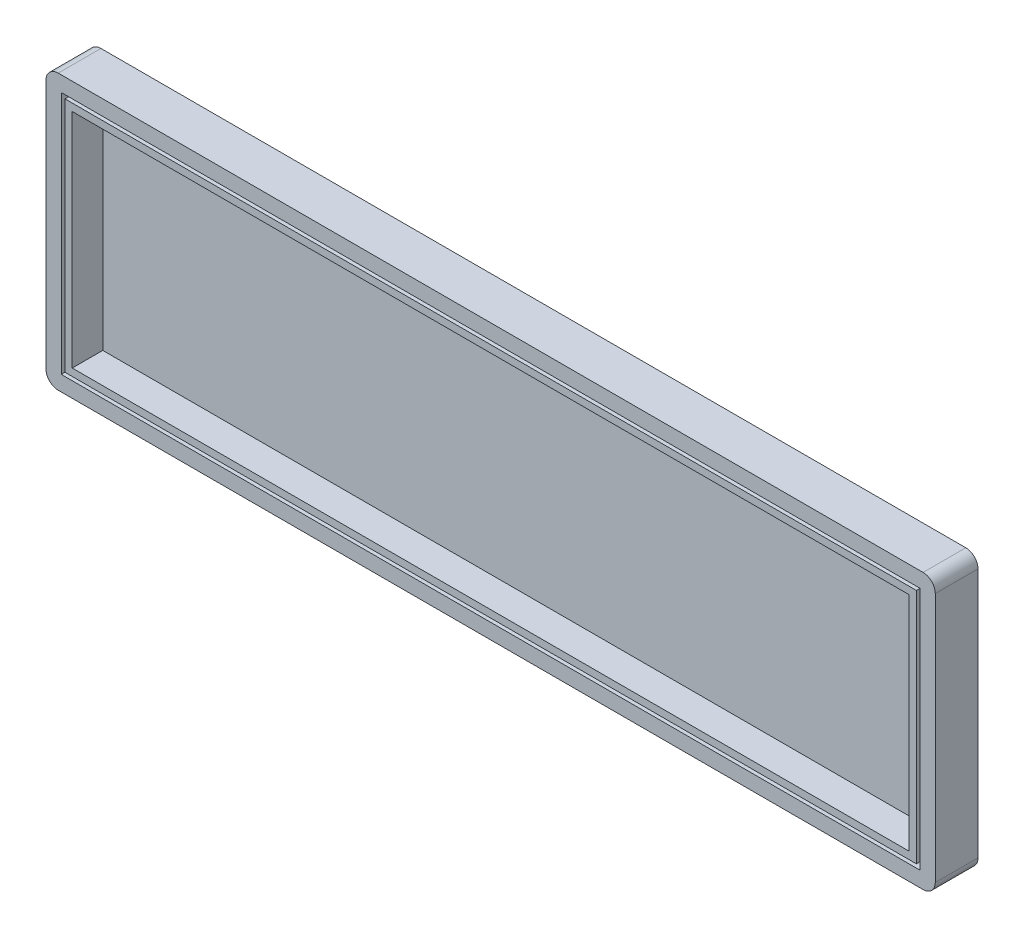
ISO-10303-21;
HEADER;
FILE_DESCRIPTION(('STEP AP214'),'2;1');
FILE_NAME('part.step','',(''),(''),'','','');
FILE_SCHEMA(('AUTOMOTIVE_DESIGN { 1 0 10303 214 1 1 1 1 }'));
ENDSEC;
DATA;
#1=APPLICATION_CONTEXT('core data for automotive mechanical design processes');
#2=APPLICATION_PROTOCOL_DEFINITION('international standard','automotive_design',2000,#1);
#3=PRODUCT_CONTEXT('',#1,'mechanical');
#4=PRODUCT('Part','Part','',(#3));
#5=PRODUCT_RELATED_PRODUCT_CATEGORY('part','',(#4));
#6=PRODUCT_DEFINITION_FORMATION('','',#4);
#7=PRODUCT_DEFINITION_CONTEXT('part definition',#1,'design');
#8=PRODUCT_DEFINITION('design','',#6,#7);
#9=PRODUCT_DEFINITION_SHAPE('','',#8);
#10=(LENGTH_UNIT() NAMED_UNIT(*) SI_UNIT(.MILLI.,.METRE.));
#11=(NAMED_UNIT(*) PLANE_ANGLE_UNIT() SI_UNIT($,.RADIAN.));
#12=(NAMED_UNIT(*) SI_UNIT($,.STERADIAN.) SOLID_ANGLE_UNIT());
#13=UNCERTAINTY_MEASURE_WITH_UNIT(LENGTH_MEASURE(1.E-05),#10,'distance_accuracy_value','');
#14=(GEOMETRIC_REPRESENTATION_CONTEXT(3) GLOBAL_UNCERTAINTY_ASSIGNED_CONTEXT((#13)) GLOBAL_UNIT_ASSIGNED_CONTEXT((#10,
#11,#12)) REPRESENTATION_CONTEXT('',''));
#15=CARTESIAN_POINT('',(0.,0.,0.));
#16=DIRECTION('',(0.,0.,1.));
#17=DIRECTION('',(1.,0.,0.));
#18=AXIS2_PLACEMENT_3D('',#15,#16,#17);
#19=CARTESIAN_POINT('',(0.,0.,2.));
#20=DIRECTION('',(1.,0.,0.));
#21=DIRECTION('',(0.,0.,-1.));
#22=AXIS2_PLACEMENT_3D('',#19,#20,#21);
#23=PLANE('',#22);
#24=DIRECTION('',(0.,-1.,0.));
#25=VECTOR('',#24,1.);
#26=CARTESIAN_POINT('',(0.,0.,7.));
#27=LINE('',#26,#25);
#28=CARTESIAN_POINT('',(0.,43.,7.));
#29=VERTEX_POINT('',#28);
#30=CARTESIAN_POINT('',(0.,2.,7.));
#31=VERTEX_POINT('',#30);
#32=EDGE_CURVE('E280',#29,#31,#27,.T.);
#33=ORIENTED_EDGE('',*,*,#32,.F.);
#34=DIRECTION('',(0.,0.,-1.));
#35=VECTOR('',#34,1.);
#36=CARTESIAN_POINT('',(0.,43.,2.));
#37=LINE('',#36,#35);
#38=CARTESIAN_POINT('',(0.,43.,0.));
#39=VERTEX_POINT('',#38);
#40=EDGE_CURVE('E12',#29,#39,#37,.T.);
#41=ORIENTED_EDGE('',*,*,#40,.T.);
#42=DIRECTION('',(0.,-1.,0.));
#43=VECTOR('',#42,1.);
#44=CARTESIAN_POINT('',(0.,0.,0.));
#45=LINE('',#44,#43);
#46=CARTESIAN_POINT('',(0.,2.,0.));
#47=VERTEX_POINT('',#46);
#48=EDGE_CURVE('E318',#39,#47,#45,.T.);
#49=ORIENTED_EDGE('',*,*,#48,.T.);
#50=DIRECTION('',(0.,0.,-1.));
#51=VECTOR('',#50,1.);
#52=CARTESIAN_POINT('',(0.,2.,2.));
#53=LINE('',#52,#51);
#54=EDGE_CURVE('E69',#47,#31,#53,.F.);
#55=ORIENTED_EDGE('',*,*,#54,.T.);
#56=EDGE_LOOP('',(#33,#41,#49,#55));
#57=FACE_BOUND('',#56,.T.);
#58=ADVANCED_FACE('F61',(#57),#23,.F.);
#59=CARTESIAN_POINT('',(0.,0.,2.));
#60=DIRECTION('',(0.,1.,0.));
#61=DIRECTION('',(0.,0.,1.));
#62=AXIS2_PLACEMENT_3D('',#59,#60,#61);
#63=PLANE('',#62);
#64=DIRECTION('',(1.,0.,0.));
#65=VECTOR('',#64,1.);
#66=CARTESIAN_POINT('',(0.,0.,0.));
#67=LINE('',#66,#65);
#68=CARTESIAN_POINT('',(2.,0.,0.));
#69=VERTEX_POINT('',#68);
#70=CARTESIAN_POINT('',(143.7,0.,0.));
#71=VERTEX_POINT('',#70);
#72=EDGE_CURVE('E321',#69,#71,#67,.T.);
#73=ORIENTED_EDGE('',*,*,#72,.T.);
#74=DIRECTION('',(0.,0.,-1.));
#75=VECTOR('',#74,1.);
#76=CARTESIAN_POINT('',(143.7,0.,2.));
#77=LINE('',#76,#75);
#78=CARTESIAN_POINT('',(143.7,0.,7.));
#79=VERTEX_POINT('',#78);
#80=EDGE_CURVE('E76',#71,#79,#77,.F.);
#81=ORIENTED_EDGE('',*,*,#80,.T.);
#82=DIRECTION('',(1.,0.,0.));
#83=VECTOR('',#82,1.);
#84=CARTESIAN_POINT('',(0.,0.,7.));
#85=LINE('',#84,#83);
#86=CARTESIAN_POINT('',(2.,0.,7.));
#87=VERTEX_POINT('',#86);
#88=EDGE_CURVE('E283',#87,#79,#85,.T.);
#89=ORIENTED_EDGE('',*,*,#88,.F.);
#90=DIRECTION('',(0.,0.,-1.));
#91=VECTOR('',#90,1.);
#92=CARTESIAN_POINT('',(2.,0.,2.));
#93=LINE('',#92,#91);
#94=EDGE_CURVE('E354',#87,#69,#93,.T.);
#95=ORIENTED_EDGE('',*,*,#94,.T.);
#96=EDGE_LOOP('',(#73,#81,#89,#95));
#97=FACE_BOUND('',#96,.T.);
#98=ADVANCED_FACE('F368',(#97),#63,.F.);
#99=CARTESIAN_POINT('',(145.7,0.,2.));
#100=DIRECTION('',(-1.,0.,0.));
#101=DIRECTION('',(0.,0.,1.));
#102=AXIS2_PLACEMENT_3D('',#99,#100,#101);
#103=PLANE('',#102);
#104=DIRECTION('',(0.,1.,0.));
#105=VECTOR('',#104,1.);
#106=CARTESIAN_POINT('',(145.7,0.,0.));
#107=LINE('',#106,#105);
#108=CARTESIAN_POINT('',(145.7,2.,0.));
#109=VERTEX_POINT('',#108);
#110=CARTESIAN_POINT('',(145.7,43.,0.));
#111=VERTEX_POINT('',#110);
#112=EDGE_CURVE('E323',#109,#111,#107,.T.);
#113=ORIENTED_EDGE('',*,*,#112,.T.);
#114=DIRECTION('',(0.,0.,-1.));
#115=VECTOR('',#114,1.);
#116=CARTESIAN_POINT('',(145.7,43.,2.));
#117=LINE('',#116,#115);
#118=CARTESIAN_POINT('',(145.7,43.,7.));
#119=VERTEX_POINT('',#118);
#120=EDGE_CURVE('E345',#111,#119,#117,.F.);
#121=ORIENTED_EDGE('',*,*,#120,.T.);
#122=DIRECTION('',(0.,1.,0.));
#123=VECTOR('',#122,1.);
#124=CARTESIAN_POINT('',(145.7,0.,7.));
#125=LINE('',#124,#123);
#126=CARTESIAN_POINT('',(145.7,2.,7.));
#127=VERTEX_POINT('',#126);
#128=EDGE_CURVE('E285',#127,#119,#125,.T.);
#129=ORIENTED_EDGE('',*,*,#128,.F.);
#130=DIRECTION('',(0.,0.,-1.));
#131=VECTOR('',#130,1.);
#132=CARTESIAN_POINT('',(145.7,2.,2.));
#133=LINE('',#132,#131);
#134=EDGE_CURVE('E342',#127,#109,#133,.T.);
#135=ORIENTED_EDGE('',*,*,#134,.T.);
#136=EDGE_LOOP('',(#113,#121,#129,#135));
#137=FACE_BOUND('',#136,.T.);
#138=ADVANCED_FACE('F379',(#137),#103,.F.);
#139=CARTESIAN_POINT('',(0.,45.,2.));
#140=DIRECTION('',(0.,-1.,0.));
#141=DIRECTION('',(0.,0.,-1.));
#142=AXIS2_PLACEMENT_3D('',#139,#140,#141);
#143=PLANE('',#142);
#144=DIRECTION('',(-1.,0.,0.));
#145=VECTOR('',#144,1.);
#146=CARTESIAN_POINT('',(0.,45.,7.));
#147=LINE('',#146,#145);
#148=CARTESIAN_POINT('',(143.7,45.,7.));
#149=VERTEX_POINT('',#148);
#150=CARTESIAN_POINT('',(2.,45.,7.));
#151=VERTEX_POINT('',#150);
#152=EDGE_CURVE('E277',#149,#151,#147,.T.);
#153=ORIENTED_EDGE('',*,*,#152,.F.);
#154=DIRECTION('',(0.,0.,-1.));
#155=VECTOR('',#154,1.);
#156=CARTESIAN_POINT('',(143.7,45.,2.));
#157=LINE('',#156,#155);
#158=CARTESIAN_POINT('',(143.7,45.,0.));
#159=VERTEX_POINT('',#158);
#160=EDGE_CURVE('E331',#149,#159,#157,.T.);
#161=ORIENTED_EDGE('',*,*,#160,.T.);
#162=DIRECTION('',(-1.,0.,0.));
#163=VECTOR('',#162,1.);
#164=CARTESIAN_POINT('',(0.,45.,0.));
#165=LINE('',#164,#163);
#166=CARTESIAN_POINT('',(2.,45.,0.));
#167=VERTEX_POINT('',#166);
#168=EDGE_CURVE('E326',#159,#167,#165,.T.);
#169=ORIENTED_EDGE('',*,*,#168,.T.);
#170=DIRECTION('',(0.,0.,-1.));
#171=VECTOR('',#170,1.);
#172=CARTESIAN_POINT('',(2.,45.,2.));
#173=LINE('',#172,#171);
#174=EDGE_CURVE('E329',#167,#151,#173,.F.);
#175=ORIENTED_EDGE('',*,*,#174,.T.);
#176=EDGE_LOOP('',(#153,#161,#169,#175));
#177=FACE_BOUND('',#176,.T.);
#178=ADVANCED_FACE('F387',(#177),#143,.F.);
#179=CARTESIAN_POINT('',(0.,0.,0.));
#180=DIRECTION('',(0.,0.,-1.));
#181=DIRECTION('',(-1.,0.,0.));
#182=AXIS2_PLACEMENT_3D('',#179,#180,#181);
#183=PLANE('',#182);
#184=ORIENTED_EDGE('',*,*,#168,.F.);
#185=CARTESIAN_POINT('',(143.7,43.,0.));
#186=DIRECTION('',(0.,0.,-1.));
#187=DIRECTION('',(-1.,0.,0.));
#188=AXIS2_PLACEMENT_3D('',#185,#186,#187);
#189=CIRCLE('',#188,2.);
#190=EDGE_CURVE('E340',#159,#111,#189,.T.);
#191=ORIENTED_EDGE('',*,*,#190,.T.);
#192=ORIENTED_EDGE('',*,*,#112,.F.);
#193=CARTESIAN_POINT('',(143.7,2.,0.));
#194=DIRECTION('',(0.,0.,-1.));
#195=DIRECTION('',(-1.,0.,0.));
#196=AXIS2_PLACEMENT_3D('',#193,#194,#195);
#197=CIRCLE('',#196,2.);
#198=EDGE_CURVE('E338',#109,#71,#197,.T.);
#199=ORIENTED_EDGE('',*,*,#198,.T.);
#200=ORIENTED_EDGE('',*,*,#72,.F.);
#201=CARTESIAN_POINT('',(2.,2.,0.));
#202=DIRECTION('',(0.,0.,-1.));
#203=DIRECTION('',(-1.,0.,0.));
#204=AXIS2_PLACEMENT_3D('',#201,#202,#203);
#205=CIRCLE('',#204,2.);
#206=EDGE_CURVE('E334',#69,#47,#205,.T.);
#207=ORIENTED_EDGE('',*,*,#206,.T.);
#208=ORIENTED_EDGE('',*,*,#48,.F.);
#209=CARTESIAN_POINT('',(2.,43.,0.));
#210=DIRECTION('',(0.,0.,-1.));
#211=DIRECTION('',(-1.,0.,0.));
#212=AXIS2_PLACEMENT_3D('',#209,#210,#211);
#213=CIRCLE('',#212,2.);
#214=EDGE_CURVE('E336',#39,#167,#213,.T.);
#215=ORIENTED_EDGE('',*,*,#214,.T.);
#216=EDGE_LOOP('',(#184,#191,#192,#199,#200,#207,#208,#215));
#217=FACE_BOUND('',#216,.T.);
#218=ADVANCED_FACE('F371',(#217),#183,.T.);
#219=CARTESIAN_POINT('',(0.,2.50000000000002,7.));
#220=DIRECTION('',(0.,-1.,0.));
#221=DIRECTION('',(0.,0.,-1.));
#222=AXIS2_PLACEMENT_3D('',#219,#220,#221);
#223=PLANE('',#222);
#224=DIRECTION('',(-1.,0.,0.));
#225=VECTOR('',#224,1.);
#226=CARTESIAN_POINT('',(0.,2.50000000000002,2.));
#227=LINE('',#226,#225);
#228=CARTESIAN_POINT('',(143.2,2.50000000000002,2.));
#229=VERTEX_POINT('',#228);
#230=CARTESIAN_POINT('',(2.5,2.50000000000002,2.));
#231=VERTEX_POINT('',#230);
#232=EDGE_CURVE('E271',#229,#231,#227,.T.);
#233=ORIENTED_EDGE('',*,*,#232,.T.);
#234=DIRECTION('',(0.,0.,-1.));
#235=VECTOR('',#234,1.);
#236=CARTESIAN_POINT('',(2.5,2.50000000000002,7.));
#237=LINE('',#236,#235);
#238=CARTESIAN_POINT('',(2.5,2.50000000000002,7.));
#239=VERTEX_POINT('',#238);
#240=EDGE_CURVE('E316',#239,#231,#237,.T.);
#241=ORIENTED_EDGE('',*,*,#240,.F.);
#242=DIRECTION('',(-1.,0.,0.));
#243=VECTOR('',#242,1.);
#244=CARTESIAN_POINT('',(0.,2.50000000000002,7.));
#245=LINE('',#244,#243);
#246=CARTESIAN_POINT('',(143.2,2.50000000000002,7.));
#247=VERTEX_POINT('',#246);
#248=EDGE_CURVE('E288',#247,#239,#245,.T.);
#249=ORIENTED_EDGE('',*,*,#248,.F.);
#250=DIRECTION('',(0.,0.,-1.));
#251=VECTOR('',#250,1.);
#252=CARTESIAN_POINT('',(143.2,2.50000000000002,7.));
#253=LINE('',#252,#251);
#254=EDGE_CURVE('E299',#247,#229,#253,.T.);
#255=ORIENTED_EDGE('',*,*,#254,.T.);
#256=EDGE_LOOP('',(#233,#241,#249,#255));
#257=FACE_BOUND('',#256,.T.);
#258=ADVANCED_FACE('F439',(#257),#223,.F.);
#259=CARTESIAN_POINT('',(2.5,0.,7.));
#260=DIRECTION('',(-1.,0.,0.));
#261=DIRECTION('',(0.,0.,1.));
#262=AXIS2_PLACEMENT_3D('',#259,#260,#261);
#263=PLANE('',#262);
#264=DIRECTION('',(0.,1.,0.));
#265=VECTOR('',#264,1.);
#266=CARTESIAN_POINT('',(2.5,0.,2.));
#267=LINE('',#266,#265);
#268=CARTESIAN_POINT('',(2.5,42.5,2.));
#269=VERTEX_POINT('',#268);
#270=EDGE_CURVE('E302',#231,#269,#267,.T.);
#271=ORIENTED_EDGE('',*,*,#270,.T.);
#272=DIRECTION('',(0.,0.,-1.));
#273=VECTOR('',#272,1.);
#274=CARTESIAN_POINT('',(2.5,42.5,7.));
#275=LINE('',#274,#273);
#276=CARTESIAN_POINT('',(2.5,42.5,7.));
#277=VERTEX_POINT('',#276);
#278=EDGE_CURVE('E314',#277,#269,#275,.T.);
#279=ORIENTED_EDGE('',*,*,#278,.F.);
#280=DIRECTION('',(0.,1.,0.));
#281=VECTOR('',#280,1.);
#282=CARTESIAN_POINT('',(2.5,0.,7.));
#283=LINE('',#282,#281);
#284=EDGE_CURVE('E291',#239,#277,#283,.T.);
#285=ORIENTED_EDGE('',*,*,#284,.F.);
#286=ORIENTED_EDGE('',*,*,#240,.T.);
#287=EDGE_LOOP('',(#271,#279,#285,#286));
#288=FACE_BOUND('',#287,.T.);
#289=ADVANCED_FACE('F448',(#288),#263,.F.);
#290=CARTESIAN_POINT('',(0.,42.5,7.));
#291=DIRECTION('',(0.,-1.,0.));
#292=DIRECTION('',(0.,0.,-1.));
#293=AXIS2_PLACEMENT_3D('',#290,#291,#292);
#294=PLANE('',#293);
#295=DIRECTION('',(-1.,0.,0.));
#296=VECTOR('',#295,1.);
#297=CARTESIAN_POINT('',(0.,42.5,2.));
#298=LINE('',#297,#296);
#299=CARTESIAN_POINT('',(143.2,42.5,2.));
#300=VERTEX_POINT('',#299);
#301=EDGE_CURVE('E305',#300,#269,#298,.T.);
#302=ORIENTED_EDGE('',*,*,#301,.F.);
#303=DIRECTION('',(0.,0.,-1.));
#304=VECTOR('',#303,1.);
#305=CARTESIAN_POINT('',(143.2,42.5,7.));
#306=LINE('',#305,#304);
#307=CARTESIAN_POINT('',(143.2,42.5,7.));
#308=VERTEX_POINT('',#307);
#309=EDGE_CURVE('E311',#308,#300,#306,.T.);
#310=ORIENTED_EDGE('',*,*,#309,.F.);
#311=DIRECTION('',(-1.,0.,0.));
#312=VECTOR('',#311,1.);
#313=CARTESIAN_POINT('',(0.,42.5,7.));
#314=LINE('',#313,#312);
#315=EDGE_CURVE('E293',#308,#277,#314,.T.);
#316=ORIENTED_EDGE('',*,*,#315,.T.);
#317=ORIENTED_EDGE('',*,*,#278,.T.);
#318=EDGE_LOOP('',(#302,#310,#316,#317));
#319=FACE_BOUND('',#318,.T.);
#320=ADVANCED_FACE('F445',(#319),#294,.T.);
#321=CARTESIAN_POINT('',(143.2,0.,7.));
#322=DIRECTION('',(-1.,0.,0.));
#323=DIRECTION('',(0.,0.,1.));
#324=AXIS2_PLACEMENT_3D('',#321,#322,#323);
#325=PLANE('',#324);
#326=DIRECTION('',(0.,1.,0.));
#327=VECTOR('',#326,1.);
#328=CARTESIAN_POINT('',(143.2,0.,2.));
#329=LINE('',#328,#327);
#330=EDGE_CURVE('E281',#229,#300,#329,.T.);
#331=ORIENTED_EDGE('',*,*,#330,.F.);
#332=ORIENTED_EDGE('',*,*,#254,.F.);
#333=DIRECTION('',(0.,1.,0.));
#334=VECTOR('',#333,1.);
#335=CARTESIAN_POINT('',(143.2,0.,7.));
#336=LINE('',#335,#334);
#337=EDGE_CURVE('E296',#247,#308,#336,.T.);
#338=ORIENTED_EDGE('',*,*,#337,.T.);
#339=ORIENTED_EDGE('',*,*,#309,.T.);
#340=EDGE_LOOP('',(#331,#332,#338,#339));
#341=FACE_BOUND('',#340,.T.);
#342=ADVANCED_FACE('F431',(#341),#325,.T.);
#343=CARTESIAN_POINT('',(0.,0.,7.));
#344=DIRECTION('',(0.,0.,1.));
#345=DIRECTION('',(1.,0.,0.));
#346=AXIS2_PLACEMENT_3D('',#343,#344,#345);
#347=PLANE('',#346);
#348=ORIENTED_EDGE('',*,*,#128,.T.);
#349=CARTESIAN_POINT('',(143.7,43.,7.));
#350=DIRECTION('',(0.,0.,1.));
#351=DIRECTION('',(1.,0.,0.));
#352=AXIS2_PLACEMENT_3D('',#349,#350,#351);
#353=CIRCLE('',#352,2.);
#354=EDGE_CURVE('E352',#119,#149,#353,.T.);
#355=ORIENTED_EDGE('',*,*,#354,.T.);
#356=ORIENTED_EDGE('',*,*,#152,.T.);
#357=CARTESIAN_POINT('',(2.,43.,7.));
#358=DIRECTION('',(0.,0.,1.));
#359=DIRECTION('',(1.,0.,0.));
#360=AXIS2_PLACEMENT_3D('',#357,#358,#359);
#361=CIRCLE('',#360,2.);
#362=EDGE_CURVE('E348',#151,#29,#361,.T.);
#363=ORIENTED_EDGE('',*,*,#362,.T.);
#364=ORIENTED_EDGE('',*,*,#32,.T.);
#365=CARTESIAN_POINT('',(2.,2.,7.));
#366=DIRECTION('',(0.,0.,1.));
#367=DIRECTION('',(1.,0.,0.));
#368=AXIS2_PLACEMENT_3D('',#365,#366,#367);
#369=CIRCLE('',#368,2.);
#370=EDGE_CURVE('E83',#31,#87,#369,.T.);
#371=ORIENTED_EDGE('',*,*,#370,.T.);
#372=ORIENTED_EDGE('',*,*,#88,.T.);
#373=CARTESIAN_POINT('',(143.7,2.,7.));
#374=DIRECTION('',(0.,0.,1.));
#375=DIRECTION('',(1.,0.,0.));
#376=AXIS2_PLACEMENT_3D('',#373,#374,#375);
#377=CIRCLE('',#376,2.);
#378=EDGE_CURVE('E350',#79,#127,#377,.T.);
#379=ORIENTED_EDGE('',*,*,#378,.T.);
#380=EDGE_LOOP('',(#348,#355,#356,#363,#364,#371,#372,#379));
#381=FACE_BOUND('',#380,.T.);
#382=ORIENTED_EDGE('',*,*,#248,.T.);
#383=ORIENTED_EDGE('',*,*,#284,.T.);
#384=ORIENTED_EDGE('',*,*,#315,.F.);
#385=ORIENTED_EDGE('',*,*,#337,.F.);
#386=EDGE_LOOP('',(#382,#383,#384,#385));
#387=FACE_BOUND('',#386,.T.);
#388=ADVANCED_FACE('F363',(#381,#387),#347,.T.);
#389=CARTESIAN_POINT('',(0.,0.,2.));
#390=DIRECTION('',(0.,0.,-1.));
#391=DIRECTION('',(-1.,0.,0.));
#392=AXIS2_PLACEMENT_3D('',#389,#390,#391);
#393=PLANE('',#392);
#394=DIRECTION('',(1.,0.,0.));
#395=VECTOR('',#394,1.);
#396=CARTESIAN_POINT('',(0.,41.9,2.));
#397=LINE('',#396,#395);
#398=CARTESIAN_POINT('',(3.10000000000001,41.9,2.));
#399=VERTEX_POINT('',#398);
#400=CARTESIAN_POINT('',(142.6,41.9,2.));
#401=VERTEX_POINT('',#400);
#402=EDGE_CURVE('E244',#399,#401,#397,.T.);
#403=ORIENTED_EDGE('',*,*,#402,.T.);
#404=DIRECTION('',(0.,-1.,0.));
#405=VECTOR('',#404,1.);
#406=CARTESIAN_POINT('',(142.6,0.,2.));
#407=LINE('',#406,#405);
#408=CARTESIAN_POINT('',(142.6,3.10000000000003,2.));
#409=VERTEX_POINT('',#408);
#410=EDGE_CURVE('E206',#401,#409,#407,.T.);
#411=ORIENTED_EDGE('',*,*,#410,.T.);
#412=DIRECTION('',(1.,0.,0.));
#413=VECTOR('',#412,1.);
#414=CARTESIAN_POINT('',(0.,3.10000000000003,2.));
#415=LINE('',#414,#413);
#416=CARTESIAN_POINT('',(3.10000000000001,3.10000000000003,2.));
#417=VERTEX_POINT('',#416);
#418=EDGE_CURVE('E249',#417,#409,#415,.T.);
#419=ORIENTED_EDGE('',*,*,#418,.F.);
#420=DIRECTION('',(0.,-1.,0.));
#421=VECTOR('',#420,1.);
#422=CARTESIAN_POINT('',(3.10000000000001,0.,2.));
#423=LINE('',#422,#421);
#424=EDGE_CURVE('E246',#399,#417,#423,.T.);
#425=ORIENTED_EDGE('',*,*,#424,.F.);
#426=EDGE_LOOP('',(#403,#411,#419,#425));
#427=FACE_BOUND('',#426,.T.);
#428=ORIENTED_EDGE('',*,*,#232,.F.);
#429=ORIENTED_EDGE('',*,*,#330,.T.);
#430=ORIENTED_EDGE('',*,*,#301,.T.);
#431=ORIENTED_EDGE('',*,*,#270,.F.);
#432=EDGE_LOOP('',(#428,#429,#430,#431));
#433=FACE_BOUND('',#432,.T.);
#434=ADVANCED_FACE('F412',(#427,#433),#393,.F.);
#435=CARTESIAN_POINT('',(0.,40.7,7.));
#436=DIRECTION('',(0.,1.,0.));
#437=DIRECTION('',(0.,0.,1.));
#438=AXIS2_PLACEMENT_3D('',#435,#436,#437);
#439=PLANE('',#438);
#440=DIRECTION('',(1.,0.,0.));
#441=VECTOR('',#440,1.);
#442=CARTESIAN_POINT('',(0.,40.7,2.));
#443=LINE('',#442,#441);
#444=CARTESIAN_POINT('',(4.30000000000001,40.7,2.));
#445=VERTEX_POINT('',#444);
#446=CARTESIAN_POINT('',(141.4,40.7,2.));
#447=VERTEX_POINT('',#446);
#448=EDGE_CURVE('E252',#445,#447,#443,.T.);
#449=ORIENTED_EDGE('',*,*,#448,.T.);
#450=DIRECTION('',(0.,0.,-1.));
#451=VECTOR('',#450,1.);
#452=CARTESIAN_POINT('',(141.4,40.7,7.));
#453=LINE('',#452,#451);
#454=CARTESIAN_POINT('',(141.4,40.7,7.));
#455=VERTEX_POINT('',#454);
#456=EDGE_CURVE('E269',#455,#447,#453,.T.);
#457=ORIENTED_EDGE('',*,*,#456,.F.);
#458=DIRECTION('',(1.,0.,0.));
#459=VECTOR('',#458,1.);
#460=CARTESIAN_POINT('',(0.,40.7,7.));
#461=LINE('',#460,#459);
#462=CARTESIAN_POINT('',(4.30000000000001,40.7,7.));
#463=VERTEX_POINT('',#462);
#464=EDGE_CURVE('E231',#463,#455,#461,.T.);
#465=ORIENTED_EDGE('',*,*,#464,.F.);
#466=DIRECTION('',(0.,0.,-1.));
#467=VECTOR('',#466,1.);
#468=CARTESIAN_POINT('',(4.30000000000001,40.7,7.));
#469=LINE('',#468,#467);
#470=EDGE_CURVE('E210',#463,#445,#469,.T.);
#471=ORIENTED_EDGE('',*,*,#470,.T.);
#472=EDGE_LOOP('',(#449,#457,#465,#471));
#473=FACE_BOUND('',#472,.T.);
#474=ADVANCED_FACE('F422',(#473),#439,.F.);
#475=CARTESIAN_POINT('',(141.4,0.,7.));
#476=DIRECTION('',(1.,0.,0.));
#477=DIRECTION('',(0.,0.,-1.));
#478=AXIS2_PLACEMENT_3D('',#475,#476,#477);
#479=PLANE('',#478);
#480=DIRECTION('',(0.,-1.,0.));
#481=VECTOR('',#480,1.);
#482=CARTESIAN_POINT('',(141.4,0.,2.));
#483=LINE('',#482,#481);
#484=CARTESIAN_POINT('',(141.4,4.30000000000002,2.));
#485=VERTEX_POINT('',#484);
#486=EDGE_CURVE('E255',#447,#485,#483,.T.);
#487=ORIENTED_EDGE('',*,*,#486,.T.);
#488=DIRECTION('',(0.,0.,-1.));
#489=VECTOR('',#488,1.);
#490=CARTESIAN_POINT('',(141.4,4.30000000000002,7.));
#491=LINE('',#490,#489);
#492=CARTESIAN_POINT('',(141.4,4.30000000000002,7.));
#493=VERTEX_POINT('',#492);
#494=EDGE_CURVE('E267',#493,#485,#491,.T.);
#495=ORIENTED_EDGE('',*,*,#494,.F.);
#496=DIRECTION('',(0.,-1.,0.));
#497=VECTOR('',#496,1.);
#498=CARTESIAN_POINT('',(141.4,0.,7.));
#499=LINE('',#498,#497);
#500=EDGE_CURVE('E234',#455,#493,#499,.T.);
#501=ORIENTED_EDGE('',*,*,#500,.F.);
#502=ORIENTED_EDGE('',*,*,#456,.T.);
#503=EDGE_LOOP('',(#487,#495,#501,#502));
#504=FACE_BOUND('',#503,.T.);
#505=ADVANCED_FACE('F428',(#504),#479,.F.);
#506=CARTESIAN_POINT('',(0.,4.30000000000002,7.));
#507=DIRECTION('',(0.,1.,0.));
#508=DIRECTION('',(0.,0.,1.));
#509=AXIS2_PLACEMENT_3D('',#506,#507,#508);
#510=PLANE('',#509);
#511=DIRECTION('',(1.,0.,0.));
#512=VECTOR('',#511,1.);
#513=CARTESIAN_POINT('',(0.,4.30000000000002,2.));
#514=LINE('',#513,#512);
#515=CARTESIAN_POINT('',(4.30000000000001,4.30000000000002,2.));
#516=VERTEX_POINT('',#515);
#517=EDGE_CURVE('E258',#516,#485,#514,.T.);
#518=ORIENTED_EDGE('',*,*,#517,.F.);
#519=DIRECTION('',(0.,0.,-1.));
#520=VECTOR('',#519,1.);
#521=CARTESIAN_POINT('',(4.30000000000001,4.30000000000002,7.));
#522=LINE('',#521,#520);
#523=CARTESIAN_POINT('',(4.30000000000001,4.30000000000002,7.));
#524=VERTEX_POINT('',#523);
#525=EDGE_CURVE('E264',#524,#516,#522,.T.);
#526=ORIENTED_EDGE('',*,*,#525,.F.);
#527=DIRECTION('',(1.,0.,0.));
#528=VECTOR('',#527,1.);
#529=CARTESIAN_POINT('',(0.,4.30000000000002,7.));
#530=LINE('',#529,#528);
#531=EDGE_CURVE('E236',#524,#493,#530,.T.);
#532=ORIENTED_EDGE('',*,*,#531,.T.);
#533=ORIENTED_EDGE('',*,*,#494,.T.);
#534=EDGE_LOOP('',(#518,#526,#532,#533));
#535=FACE_BOUND('',#534,.T.);
#536=ADVANCED_FACE('F461',(#535),#510,.T.);
#537=CARTESIAN_POINT('',(142.6,0.,7.));
#538=DIRECTION('',(1.,0.,0.));
#539=DIRECTION('',(0.,0.,-1.));
#540=AXIS2_PLACEMENT_3D('',#537,#538,#539);
#541=PLANE('',#540);
#542=ORIENTED_EDGE('',*,*,#410,.F.);
#543=DIRECTION('',(0.,0.,-1.));
#544=VECTOR('',#543,1.);
#545=CARTESIAN_POINT('',(142.6,41.9,7.));
#546=LINE('',#545,#544);
#547=CARTESIAN_POINT('',(142.6,41.9,7.));
#548=VERTEX_POINT('',#547);
#549=EDGE_CURVE('E201',#548,#401,#546,.T.);
#550=ORIENTED_EDGE('',*,*,#549,.F.);
#551=DIRECTION('',(0.,-1.,0.));
#552=VECTOR('',#551,1.);
#553=CARTESIAN_POINT('',(142.6,0.,7.));
#554=LINE('',#553,#552);
#555=CARTESIAN_POINT('',(142.6,3.10000000000003,7.));
#556=VERTEX_POINT('',#555);
#557=EDGE_CURVE('E205',#548,#556,#554,.T.);
#558=ORIENTED_EDGE('',*,*,#557,.T.);
#559=DIRECTION('',(0.,0.,-1.));
#560=VECTOR('',#559,1.);
#561=CARTESIAN_POINT('',(142.6,3.10000000000003,7.));
#562=LINE('',#561,#560);
#563=EDGE_CURVE('E242',#556,#409,#562,.T.);
#564=ORIENTED_EDGE('',*,*,#563,.T.);
#565=EDGE_LOOP('',(#542,#550,#558,#564));
#566=FACE_BOUND('',#565,.T.);
#567=ADVANCED_FACE('F203',(#566),#541,.T.);
#568=CARTESIAN_POINT('',(0.,41.9,7.));
#569=DIRECTION('',(0.,1.,0.));
#570=DIRECTION('',(0.,0.,1.));
#571=AXIS2_PLACEMENT_3D('',#568,#569,#570);
#572=PLANE('',#571);
#573=ORIENTED_EDGE('',*,*,#402,.F.);
#574=DIRECTION('',(0.,0.,-1.));
#575=VECTOR('',#574,1.);
#576=CARTESIAN_POINT('',(3.10000000000001,41.9,7.));
#577=LINE('',#576,#575);
#578=CARTESIAN_POINT('',(3.10000000000001,41.9,7.));
#579=VERTEX_POINT('',#578);
#580=EDGE_CURVE('E211',#579,#399,#577,.T.);
#581=ORIENTED_EDGE('',*,*,#580,.F.);
#582=DIRECTION('',(1.,0.,0.));
#583=VECTOR('',#582,1.);
#584=CARTESIAN_POINT('',(0.,41.9,7.));
#585=LINE('',#584,#583);
#586=EDGE_CURVE('E217',#579,#548,#585,.T.);
#587=ORIENTED_EDGE('',*,*,#586,.T.);
#588=ORIENTED_EDGE('',*,*,#549,.T.);
#589=EDGE_LOOP('',(#573,#581,#587,#588));
#590=FACE_BOUND('',#589,.T.);
#591=ADVANCED_FACE('F223',(#590),#572,.T.);
#592=CARTESIAN_POINT('',(3.10000000000001,0.,7.));
#593=DIRECTION('',(1.,0.,0.));
#594=DIRECTION('',(0.,0.,-1.));
#595=AXIS2_PLACEMENT_3D('',#592,#593,#594);
#596=PLANE('',#595);
#597=ORIENTED_EDGE('',*,*,#424,.T.);
#598=DIRECTION('',(0.,0.,-1.));
#599=VECTOR('',#598,1.);
#600=CARTESIAN_POINT('',(3.10000000000001,3.10000000000003,7.));
#601=LINE('',#600,#599);
#602=CARTESIAN_POINT('',(3.10000000000001,3.10000000000003,7.));
#603=VERTEX_POINT('',#602);
#604=EDGE_CURVE('E273',#603,#417,#601,.T.);
#605=ORIENTED_EDGE('',*,*,#604,.F.);
#606=DIRECTION('',(0.,-1.,0.));
#607=VECTOR('',#606,1.);
#608=CARTESIAN_POINT('',(3.10000000000001,0.,7.));
#609=LINE('',#608,#607);
#610=EDGE_CURVE('E226',#579,#603,#609,.T.);
#611=ORIENTED_EDGE('',*,*,#610,.F.);
#612=ORIENTED_EDGE('',*,*,#580,.T.);
#613=EDGE_LOOP('',(#597,#605,#611,#612));
#614=FACE_BOUND('',#613,.T.);
#615=ADVANCED_FACE('F464',(#614),#596,.F.);
#616=CARTESIAN_POINT('',(0.,3.10000000000003,7.));
#617=DIRECTION('',(0.,1.,0.));
#618=DIRECTION('',(0.,0.,1.));
#619=AXIS2_PLACEMENT_3D('',#616,#617,#618);
#620=PLANE('',#619);
#621=ORIENTED_EDGE('',*,*,#418,.T.);
#622=ORIENTED_EDGE('',*,*,#563,.F.);
#623=DIRECTION('',(1.,0.,0.));
#624=VECTOR('',#623,1.);
#625=CARTESIAN_POINT('',(0.,3.10000000000003,7.));
#626=LINE('',#625,#624);
#627=EDGE_CURVE('E219',#603,#556,#626,.T.);
#628=ORIENTED_EDGE('',*,*,#627,.F.);
#629=ORIENTED_EDGE('',*,*,#604,.T.);
#630=EDGE_LOOP('',(#621,#622,#628,#629));
#631=FACE_BOUND('',#630,.T.);
#632=ADVANCED_FACE('F467',(#631),#620,.F.);
#633=CARTESIAN_POINT('',(4.30000000000001,0.,7.));
#634=DIRECTION('',(1.,0.,0.));
#635=DIRECTION('',(0.,0.,-1.));
#636=AXIS2_PLACEMENT_3D('',#633,#634,#635);
#637=PLANE('',#636);
#638=DIRECTION('',(0.,-1.,0.));
#639=VECTOR('',#638,1.);
#640=CARTESIAN_POINT('',(4.30000000000001,0.,2.));
#641=LINE('',#640,#639);
#642=EDGE_CURVE('E221',#445,#516,#641,.T.);
#643=ORIENTED_EDGE('',*,*,#642,.F.);
#644=ORIENTED_EDGE('',*,*,#470,.F.);
#645=DIRECTION('',(0.,-1.,0.));
#646=VECTOR('',#645,1.);
#647=CARTESIAN_POINT('',(4.30000000000001,0.,7.));
#648=LINE('',#647,#646);
#649=EDGE_CURVE('E239',#463,#524,#648,.T.);
#650=ORIENTED_EDGE('',*,*,#649,.T.);
#651=ORIENTED_EDGE('',*,*,#525,.T.);
#652=EDGE_LOOP('',(#643,#644,#650,#651));
#653=FACE_BOUND('',#652,.T.);
#654=ADVANCED_FACE('F416',(#653),#637,.T.);
#655=CARTESIAN_POINT('',(0.,0.,7.));
#656=DIRECTION('',(0.,0.,1.));
#657=DIRECTION('',(1.,0.,0.));
#658=AXIS2_PLACEMENT_3D('',#655,#656,#657);
#659=PLANE('',#658);
#660=ORIENTED_EDGE('',*,*,#557,.F.);
#661=ORIENTED_EDGE('',*,*,#586,.F.);
#662=ORIENTED_EDGE('',*,*,#610,.T.);
#663=ORIENTED_EDGE('',*,*,#627,.T.);
#664=EDGE_LOOP('',(#660,#661,#662,#663));
#665=FACE_BOUND('',#664,.T.);
#666=ORIENTED_EDGE('',*,*,#464,.T.);
#667=ORIENTED_EDGE('',*,*,#500,.T.);
#668=ORIENTED_EDGE('',*,*,#531,.F.);
#669=ORIENTED_EDGE('',*,*,#649,.F.);
#670=EDGE_LOOP('',(#666,#667,#668,#669));
#671=FACE_BOUND('',#670,.T.);
#672=ADVANCED_FACE('F215',(#665,#671),#659,.T.);
#673=ORIENTED_EDGE('',*,*,#448,.F.);
#674=ORIENTED_EDGE('',*,*,#642,.T.);
#675=ORIENTED_EDGE('',*,*,#517,.T.);
#676=ORIENTED_EDGE('',*,*,#486,.F.);
#677=EDGE_LOOP('',(#673,#674,#675,#676));
#678=FACE_BOUND('',#677,.T.);
#679=ADVANCED_FACE('F406',(#678),#393,.F.);
#680=CARTESIAN_POINT('',(143.7,43.,2.));
#681=DIRECTION('',(0.,0.,-1.));
#682=DIRECTION('',(-1.,0.,0.));
#683=AXIS2_PLACEMENT_3D('',#680,#681,#682);
#684=CYLINDRICAL_SURFACE('',#683,2.);
#685=ORIENTED_EDGE('',*,*,#354,.F.);
#686=ORIENTED_EDGE('',*,*,#120,.F.);
#687=ORIENTED_EDGE('',*,*,#190,.F.);
#688=ORIENTED_EDGE('',*,*,#160,.F.);
#689=EDGE_LOOP('',(#685,#686,#687,#688));
#690=FACE_BOUND('',#689,.T.);
#691=ADVANCED_FACE('F385',(#690),#684,.T.);
#692=CARTESIAN_POINT('',(143.7,2.,2.));
#693=DIRECTION('',(0.,0.,-1.));
#694=DIRECTION('',(-1.,0.,0.));
#695=AXIS2_PLACEMENT_3D('',#692,#693,#694);
#696=CYLINDRICAL_SURFACE('',#695,2.);
#697=ORIENTED_EDGE('',*,*,#378,.F.);
#698=ORIENTED_EDGE('',*,*,#80,.F.);
#699=ORIENTED_EDGE('',*,*,#198,.F.);
#700=ORIENTED_EDGE('',*,*,#134,.F.);
#701=EDGE_LOOP('',(#697,#698,#699,#700));
#702=FACE_BOUND('',#701,.T.);
#703=ADVANCED_FACE('F376',(#702),#696,.T.);
#704=CARTESIAN_POINT('',(2.,43.,2.));
#705=DIRECTION('',(0.,0.,-1.));
#706=DIRECTION('',(-1.,0.,0.));
#707=AXIS2_PLACEMENT_3D('',#704,#705,#706);
#708=CYLINDRICAL_SURFACE('',#707,2.);
#709=ORIENTED_EDGE('',*,*,#362,.F.);
#710=ORIENTED_EDGE('',*,*,#174,.F.);
#711=ORIENTED_EDGE('',*,*,#214,.F.);
#712=ORIENTED_EDGE('',*,*,#40,.F.);
#713=EDGE_LOOP('',(#709,#710,#711,#712));
#714=FACE_BOUND('',#713,.T.);
#715=ADVANCED_FACE('F390',(#714),#708,.T.);
#716=CARTESIAN_POINT('',(2.,2.,2.));
#717=DIRECTION('',(0.,0.,-1.));
#718=DIRECTION('',(-1.,0.,0.));
#719=AXIS2_PLACEMENT_3D('',#716,#717,#718);
#720=CYLINDRICAL_SURFACE('',#719,2.);
#721=ORIENTED_EDGE('',*,*,#370,.F.);
#722=ORIENTED_EDGE('',*,*,#54,.F.);
#723=ORIENTED_EDGE('',*,*,#206,.F.);
#724=ORIENTED_EDGE('',*,*,#94,.F.);
#725=EDGE_LOOP('',(#721,#722,#723,#724));
#726=FACE_BOUND('',#725,.T.);
#727=ADVANCED_FACE('F63',(#726),#720,.T.);
#728=CLOSED_SHELL('',(#58,#98,#138,#178,#218,#258,#289,#320,#342,#388,#434,#474,#505,#536,#567,
#591,#615,#632,#654,#672,#679,#691,#703,#715,#727));
#729=MANIFOLD_SOLID_BREP('B2',#728);
#730=ADVANCED_BREP_SHAPE_REPRESENTATION('',(#18,#729),#14);
#731=SHAPE_DEFINITION_REPRESENTATION(#9,#730);
ENDSEC;
END-ISO-10303-21;
